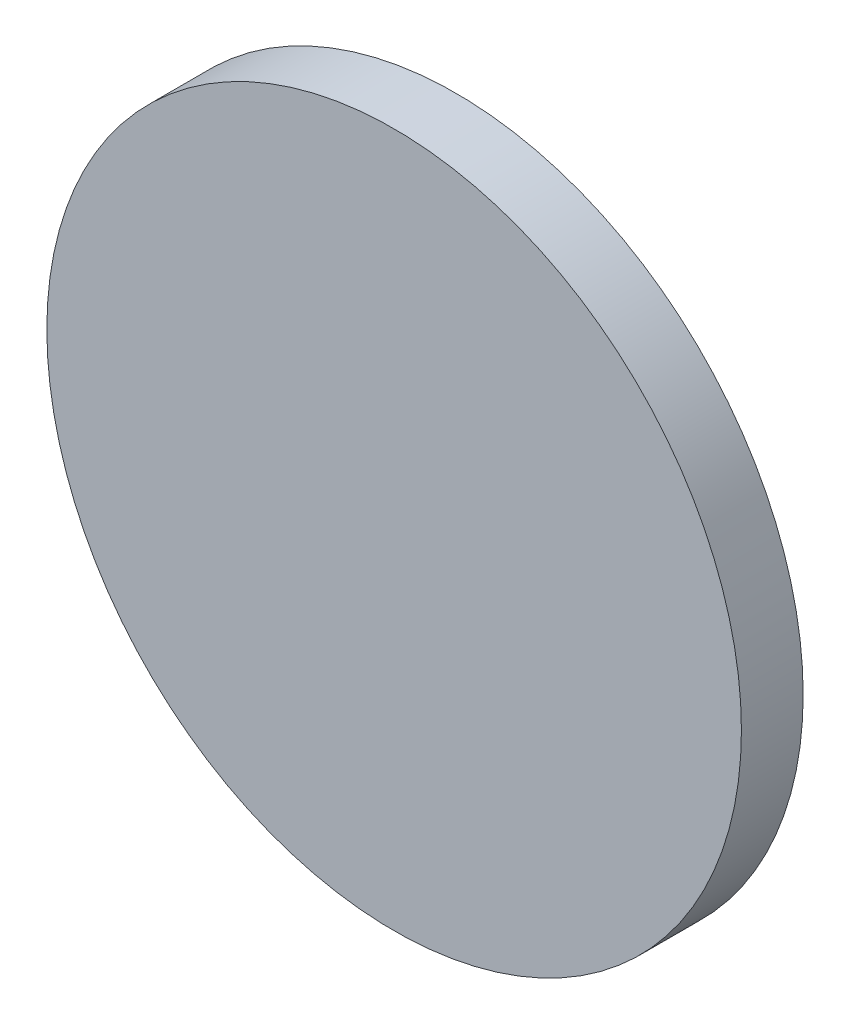
ISO-10303-21;
HEADER;
FILE_DESCRIPTION(('STEP AP214'),'2;1');
FILE_NAME('part.step','',(''),(''),'','','');
FILE_SCHEMA(('AUTOMOTIVE_DESIGN { 1 0 10303 214 1 1 1 1 }'));
ENDSEC;
DATA;
#1=APPLICATION_CONTEXT('core data for automotive mechanical design processes');
#2=APPLICATION_PROTOCOL_DEFINITION('international standard','automotive_design',2000,#1);
#3=PRODUCT_CONTEXT('',#1,'mechanical');
#4=PRODUCT('Part','Part','',(#3));
#5=PRODUCT_RELATED_PRODUCT_CATEGORY('part','',(#4));
#6=PRODUCT_DEFINITION_FORMATION('','',#4);
#7=PRODUCT_DEFINITION_CONTEXT('part definition',#1,'design');
#8=PRODUCT_DEFINITION('design','',#6,#7);
#9=PRODUCT_DEFINITION_SHAPE('','',#8);
#10=(LENGTH_UNIT() NAMED_UNIT(*) SI_UNIT(.MILLI.,.METRE.));
#11=(NAMED_UNIT(*) PLANE_ANGLE_UNIT() SI_UNIT($,.RADIAN.));
#12=(NAMED_UNIT(*) SI_UNIT($,.STERADIAN.) SOLID_ANGLE_UNIT());
#13=UNCERTAINTY_MEASURE_WITH_UNIT(LENGTH_MEASURE(1.E-05),#10,'distance_accuracy_value','');
#14=(GEOMETRIC_REPRESENTATION_CONTEXT(3) GLOBAL_UNCERTAINTY_ASSIGNED_CONTEXT((#13)) GLOBAL_UNIT_ASSIGNED_CONTEXT((#10,
#11,#12)) REPRESENTATION_CONTEXT('',''));
#15=CARTESIAN_POINT('',(0.,0.,0.));
#16=DIRECTION('',(0.,0.,1.));
#17=DIRECTION('',(1.,0.,0.));
#18=AXIS2_PLACEMENT_3D('',#15,#16,#17);
#19=CARTESIAN_POINT('',(0.,39.7742301794424,2.));
#20=DIRECTION('',(0.,0.,-1.));
#21=DIRECTION('',(-1.,0.,0.));
#22=AXIS2_PLACEMENT_3D('',#19,#20,#21);
#23=CYLINDRICAL_SURFACE('',#22,11.2507299387642);
#24=CARTESIAN_POINT('',(0.,39.7742301794424,2.));
#25=DIRECTION('',(0.,0.,1.));
#26=DIRECTION('',(1.,0.,0.));
#27=AXIS2_PLACEMENT_3D('',#24,#25,#26);
#28=CIRCLE('',#27,11.2507299387642);
#29=CARTESIAN_POINT('',(11.2507299387642,39.7742301794424,2.));
#30=VERTEX_POINT('',#29);
#31=EDGE_CURVE('E10',#30,#30,#28,.T.);
#32=ORIENTED_EDGE('',*,*,#31,.F.);
#33=EDGE_LOOP('',(#32));
#34=FACE_BOUND('',#33,.T.);
#35=CARTESIAN_POINT('',(0.,39.7742301794424,0.));
#36=DIRECTION('',(0.,0.,1.));
#37=DIRECTION('',(1.,0.,0.));
#38=AXIS2_PLACEMENT_3D('',#35,#36,#37);
#39=CIRCLE('',#38,11.2507299387642);
#40=CARTESIAN_POINT('',(11.2507299387642,39.7742301794424,0.));
#41=VERTEX_POINT('',#40);
#42=EDGE_CURVE('E36',#41,#41,#39,.T.);
#43=ORIENTED_EDGE('',*,*,#42,.T.);
#44=EDGE_LOOP('',(#43));
#45=FACE_BOUND('',#44,.T.);
#46=ADVANCED_FACE('F33',(#34,#45),#23,.T.);
#47=CARTESIAN_POINT('',(0.,39.7742301794424,2.));
#48=DIRECTION('',(0.,0.,1.));
#49=DIRECTION('',(1.,0.,0.));
#50=AXIS2_PLACEMENT_3D('',#47,#48,#49);
#51=PLANE('',#50);
#52=ORIENTED_EDGE('',*,*,#31,.T.);
#53=EDGE_LOOP('',(#52));
#54=FACE_BOUND('',#53,.T.);
#55=ADVANCED_FACE('F48',(#54),#51,.T.);
#56=CARTESIAN_POINT('',(0.,39.7742301794424,0.));
#57=DIRECTION('',(0.,0.,1.));
#58=DIRECTION('',(1.,0.,0.));
#59=AXIS2_PLACEMENT_3D('',#56,#57,#58);
#60=PLANE('',#59);
#61=ORIENTED_EDGE('',*,*,#42,.F.);
#62=EDGE_LOOP('',(#61));
#63=FACE_BOUND('',#62,.T.);
#64=ADVANCED_FACE('F46',(#63),#60,.F.);
#65=CLOSED_SHELL('',(#46,#55,#64));
#66=MANIFOLD_SOLID_BREP('B2',#65);
#67=ADVANCED_BREP_SHAPE_REPRESENTATION('',(#18,#66),#14);
#68=SHAPE_DEFINITION_REPRESENTATION(#9,#67);
ENDSEC;
END-ISO-10303-21;
